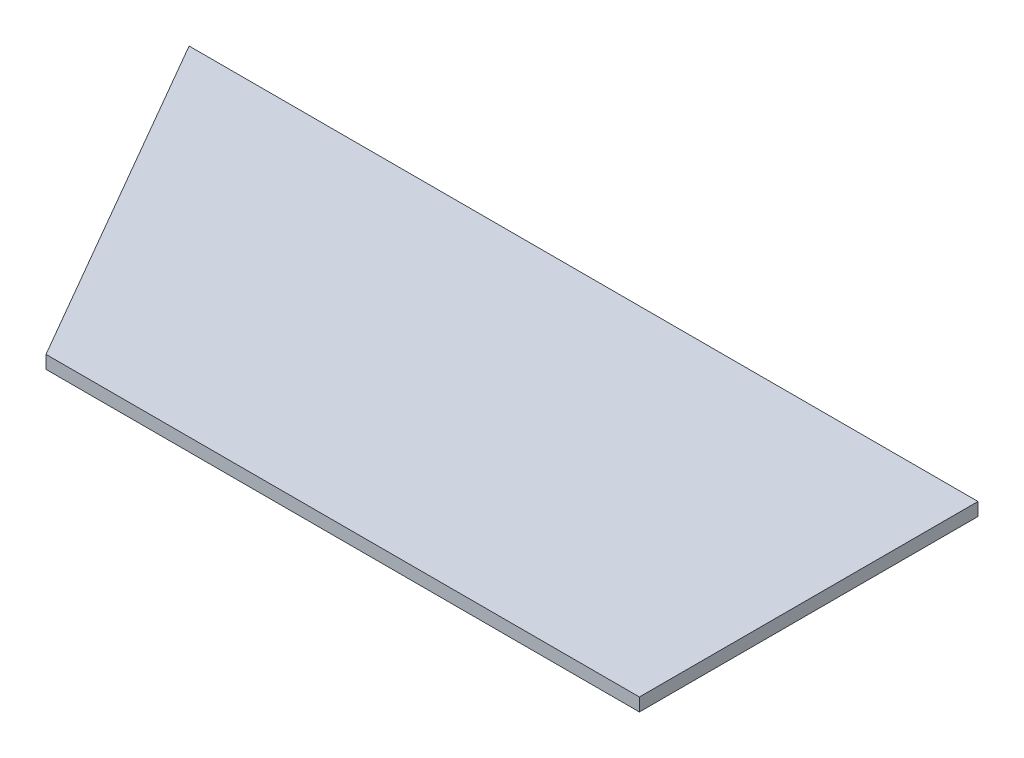
ISO-10303-21;
HEADER;
FILE_DESCRIPTION(('STEP AP214'),'2;1');
FILE_NAME('part.step','',(''),(''),'','','');
FILE_SCHEMA(('AUTOMOTIVE_DESIGN { 1 0 10303 214 1 1 1 1 }'));
ENDSEC;
DATA;
#1=APPLICATION_CONTEXT('core data for automotive mechanical design processes');
#2=APPLICATION_PROTOCOL_DEFINITION('international standard','automotive_design',2000,#1);
#3=PRODUCT_CONTEXT('',#1,'mechanical');
#4=PRODUCT('Part','Part','',(#3));
#5=PRODUCT_RELATED_PRODUCT_CATEGORY('part','',(#4));
#6=PRODUCT_DEFINITION_FORMATION('','',#4);
#7=PRODUCT_DEFINITION_CONTEXT('part definition',#1,'design');
#8=PRODUCT_DEFINITION('design','',#6,#7);
#9=PRODUCT_DEFINITION_SHAPE('','',#8);
#10=(LENGTH_UNIT() NAMED_UNIT(*) SI_UNIT(.MILLI.,.METRE.));
#11=(NAMED_UNIT(*) PLANE_ANGLE_UNIT() SI_UNIT($,.RADIAN.));
#12=(NAMED_UNIT(*) SI_UNIT($,.STERADIAN.) SOLID_ANGLE_UNIT());
#13=UNCERTAINTY_MEASURE_WITH_UNIT(LENGTH_MEASURE(1.E-05),#10,'distance_accuracy_value','');
#14=(GEOMETRIC_REPRESENTATION_CONTEXT(3) GLOBAL_UNCERTAINTY_ASSIGNED_CONTEXT((#13)) GLOBAL_UNIT_ASSIGNED_CONTEXT((#10,
#11,#12)) REPRESENTATION_CONTEXT('',''));
#15=CARTESIAN_POINT('',(0.,0.,0.));
#16=DIRECTION('',(0.,0.,1.));
#17=DIRECTION('',(1.,0.,0.));
#18=AXIS2_PLACEMENT_3D('',#15,#16,#17);
#19=CARTESIAN_POINT('',(0.,6.35,0.));
#20=DIRECTION('',(0.,1.,0.));
#21=DIRECTION('',(0.,0.,1.));
#22=AXIS2_PLACEMENT_3D('',#19,#20,#21);
#23=PLANE('',#22);
#24=DIRECTION('',(-1.,0.,0.));
#25=VECTOR('',#24,1.);
#26=CARTESIAN_POINT('',(-355.9175,6.35,-79.375));
#27=LINE('',#26,#25);
#28=CARTESIAN_POINT('',(-740.58367420942,6.35,-79.375));
#29=VERTEX_POINT('',#28);
#30=CARTESIAN_POINT('',(-355.9175,6.35,-79.375));
#31=VERTEX_POINT('',#30);
#32=EDGE_CURVE('E68',#29,#31,#27,.F.);
#33=ORIENTED_EDGE('',*,*,#32,.F.);
#34=DIRECTION('',(0.500000000000017,0.,0.866025403784429));
#35=VECTOR('',#34,1.);
#36=CARTESIAN_POINT('',(-740.58367420942,6.35,-79.375));
#37=LINE('',#36,#35);
#38=CARTESIAN_POINT('',(-645.263144766056,6.35,85.7250000000374));
#39=VERTEX_POINT('',#38);
#40=EDGE_CURVE('E20',#39,#29,#37,.F.);
#41=ORIENTED_EDGE('',*,*,#40,.F.);
#42=DIRECTION('',(1.,0.,0.));
#43=VECTOR('',#42,1.);
#44=CARTESIAN_POINT('',(-645.263144766024,6.35,85.725));
#45=LINE('',#44,#43);
#46=CARTESIAN_POINT('',(-355.9175,6.35,85.7250000000127));
#47=VERTEX_POINT('',#46);
#48=EDGE_CURVE('E58',#47,#39,#45,.F.);
#49=ORIENTED_EDGE('',*,*,#48,.F.);
#50=DIRECTION('',(0.,0.,-1.));
#51=VECTOR('',#50,1.);
#52=CARTESIAN_POINT('',(-355.9175,6.35,85.725));
#53=LINE('',#52,#51);
#54=EDGE_CURVE('E53',#31,#47,#53,.F.);
#55=ORIENTED_EDGE('',*,*,#54,.F.);
#56=EDGE_LOOP('',(#33,#41,#49,#55));
#57=FACE_BOUND('',#56,.T.);
#58=ADVANCED_FACE('F17',(#57),#23,.T.);
#59=CARTESIAN_POINT('',(-740.58367420942,0.,-79.375));
#60=DIRECTION('',(-0.866025403784429,0.,0.500000000000017));
#61=DIRECTION('',(0.500000000000017,0.,0.866025403784429));
#62=AXIS2_PLACEMENT_3D('',#59,#60,#61);
#63=PLANE('',#62);
#64=DIRECTION('',(0.,1.,0.));
#65=VECTOR('',#64,1.);
#66=CARTESIAN_POINT('',(-740.58367420942,0.,-79.375));
#67=LINE('',#66,#65);
#68=CARTESIAN_POINT('',(-740.58367420942,0.,-79.375));
#69=VERTEX_POINT('',#68);
#70=EDGE_CURVE('E79',#69,#29,#67,.T.);
#71=ORIENTED_EDGE('',*,*,#70,.F.);
#72=DIRECTION('',(0.500000000000685,0.,0.866025403784043));
#73=VECTOR('',#72,1.);
#74=CARTESIAN_POINT('',(-740.58367420942,0.,-79.375));
#75=LINE('',#74,#73);
#76=CARTESIAN_POINT('',(-645.263144766088,0.,85.7250000000558));
#77=VERTEX_POINT('',#76);
#78=EDGE_CURVE('E74',#69,#77,#75,.T.);
#79=ORIENTED_EDGE('',*,*,#78,.T.);
#80=DIRECTION('',(0.,1.,0.));
#81=VECTOR('',#80,1.);
#82=CARTESIAN_POINT('',(-645.263144766024,0.,85.725));
#83=LINE('',#82,#81);
#84=EDGE_CURVE('E63',#39,#77,#83,.F.);
#85=ORIENTED_EDGE('',*,*,#84,.F.);
#86=ORIENTED_EDGE('',*,*,#40,.T.);
#87=EDGE_LOOP('',(#71,#79,#85,#86));
#88=FACE_BOUND('',#87,.T.);
#89=ADVANCED_FACE('F73',(#88),#63,.T.);
#90=CARTESIAN_POINT('',(-645.263144766024,0.,85.725));
#91=DIRECTION('',(0.,0.,1.));
#92=DIRECTION('',(1.,0.,0.));
#93=AXIS2_PLACEMENT_3D('',#90,#91,#92);
#94=PLANE('',#93);
#95=ORIENTED_EDGE('',*,*,#84,.T.);
#96=DIRECTION('',(1.,0.,0.));
#97=VECTOR('',#96,1.);
#98=CARTESIAN_POINT('',(0.,0.,85.7250000000254));
#99=LINE('',#98,#97);
#100=CARTESIAN_POINT('',(-355.9175,0.,85.7250000000063));
#101=VERTEX_POINT('',#100);
#102=EDGE_CURVE('E84',#77,#101,#99,.T.);
#103=ORIENTED_EDGE('',*,*,#102,.T.);
#104=DIRECTION('',(0.,1.,0.));
#105=VECTOR('',#104,1.);
#106=CARTESIAN_POINT('',(-355.9175,0.,85.725));
#107=LINE('',#106,#105);
#108=EDGE_CURVE('E65',#47,#101,#107,.F.);
#109=ORIENTED_EDGE('',*,*,#108,.F.);
#110=ORIENTED_EDGE('',*,*,#48,.T.);
#111=EDGE_LOOP('',(#95,#103,#109,#110));
#112=FACE_BOUND('',#111,.T.);
#113=ADVANCED_FACE('F60',(#112),#94,.T.);
#114=CARTESIAN_POINT('',(-355.9175,0.,85.725));
#115=DIRECTION('',(1.,0.,0.));
#116=DIRECTION('',(0.,0.,-1.));
#117=AXIS2_PLACEMENT_3D('',#114,#115,#116);
#118=PLANE('',#117);
#119=ORIENTED_EDGE('',*,*,#108,.T.);
#120=DIRECTION('',(0.,0.,1.));
#121=VECTOR('',#120,1.);
#122=CARTESIAN_POINT('',(-355.9175,0.,0.));
#123=LINE('',#122,#121);
#124=CARTESIAN_POINT('',(-355.9175,0.,-79.375));
#125=VERTEX_POINT('',#124);
#126=EDGE_CURVE('E26',#101,#125,#123,.F.);
#127=ORIENTED_EDGE('',*,*,#126,.T.);
#128=DIRECTION('',(0.,1.,0.));
#129=VECTOR('',#128,1.);
#130=CARTESIAN_POINT('',(-355.9175,0.,-79.375));
#131=LINE('',#130,#129);
#132=EDGE_CURVE('E34',#31,#125,#131,.F.);
#133=ORIENTED_EDGE('',*,*,#132,.F.);
#134=ORIENTED_EDGE('',*,*,#54,.T.);
#135=EDGE_LOOP('',(#119,#127,#133,#134));
#136=FACE_BOUND('',#135,.T.);
#137=ADVANCED_FACE('F88',(#136),#118,.T.);
#138=CARTESIAN_POINT('',(-355.9175,0.,-79.375));
#139=DIRECTION('',(0.,0.,-1.));
#140=DIRECTION('',(-1.,0.,0.));
#141=AXIS2_PLACEMENT_3D('',#138,#139,#140);
#142=PLANE('',#141);
#143=ORIENTED_EDGE('',*,*,#132,.T.);
#144=DIRECTION('',(1.,0.,0.));
#145=VECTOR('',#144,1.);
#146=CARTESIAN_POINT('',(0.,0.,-79.375));
#147=LINE('',#146,#145);
#148=EDGE_CURVE('E11',#125,#69,#147,.F.);
#149=ORIENTED_EDGE('',*,*,#148,.T.);
#150=ORIENTED_EDGE('',*,*,#70,.T.);
#151=ORIENTED_EDGE('',*,*,#32,.T.);
#152=EDGE_LOOP('',(#143,#149,#150,#151));
#153=FACE_BOUND('',#152,.T.);
#154=ADVANCED_FACE('F91',(#153),#142,.T.);
#155=CARTESIAN_POINT('',(0.,0.,0.));
#156=DIRECTION('',(0.,1.,0.));
#157=DIRECTION('',(0.,0.,1.));
#158=AXIS2_PLACEMENT_3D('',#155,#156,#157);
#159=PLANE('',#158);
#160=ORIENTED_EDGE('',*,*,#126,.F.);
#161=ORIENTED_EDGE('',*,*,#102,.F.);
#162=ORIENTED_EDGE('',*,*,#78,.F.);
#163=ORIENTED_EDGE('',*,*,#148,.F.);
#164=EDGE_LOOP('',(#160,#161,#162,#163));
#165=FACE_BOUND('',#164,.T.);
#166=ADVANCED_FACE('F90',(#165),#159,.F.);
#167=CLOSED_SHELL('',(#58,#89,#113,#137,#154,#166));
#168=MANIFOLD_SOLID_BREP('B1',#167);
#169=ADVANCED_BREP_SHAPE_REPRESENTATION('',(#18,#168),#14);
#170=SHAPE_DEFINITION_REPRESENTATION(#9,#169);
ENDSEC;
END-ISO-10303-21;
